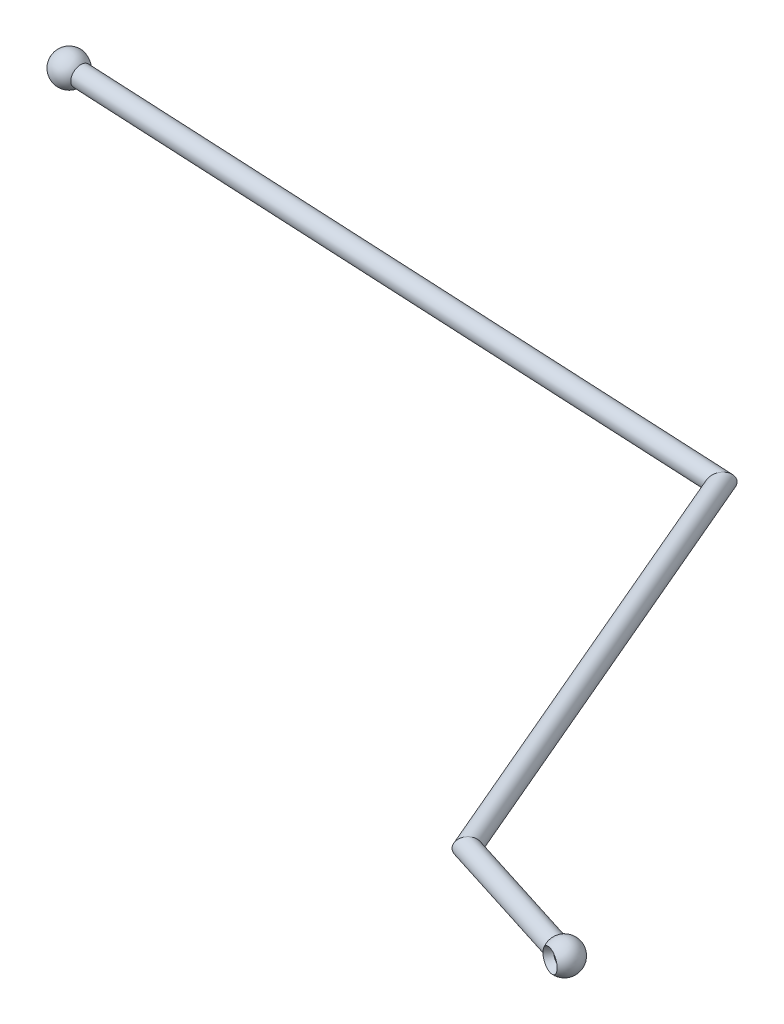
ISO-10303-21;
HEADER;
FILE_DESCRIPTION(('STEP AP214'),'2;1');
FILE_NAME('part.step','',(''),(''),'','','');
FILE_SCHEMA(('AUTOMOTIVE_DESIGN { 1 0 10303 214 1 1 1 1 }'));
ENDSEC;
DATA;
#1=APPLICATION_CONTEXT('core data for automotive mechanical design processes');
#2=APPLICATION_PROTOCOL_DEFINITION('international standard','automotive_design',2000,#1);
#3=PRODUCT_CONTEXT('',#1,'mechanical');
#4=PRODUCT('Part','Part','',(#3));
#5=PRODUCT_RELATED_PRODUCT_CATEGORY('part','',(#4));
#6=PRODUCT_DEFINITION_FORMATION('','',#4);
#7=PRODUCT_DEFINITION_CONTEXT('part definition',#1,'design');
#8=PRODUCT_DEFINITION('design','',#6,#7);
#9=PRODUCT_DEFINITION_SHAPE('','',#8);
#10=(LENGTH_UNIT() NAMED_UNIT(*) SI_UNIT(.MILLI.,.METRE.));
#11=(NAMED_UNIT(*) PLANE_ANGLE_UNIT() SI_UNIT($,.RADIAN.));
#12=(NAMED_UNIT(*) SI_UNIT($,.STERADIAN.) SOLID_ANGLE_UNIT());
#13=UNCERTAINTY_MEASURE_WITH_UNIT(LENGTH_MEASURE(1.E-05),#10,'distance_accuracy_value','');
#14=(GEOMETRIC_REPRESENTATION_CONTEXT(3) GLOBAL_UNCERTAINTY_ASSIGNED_CONTEXT((#13)) GLOBAL_UNIT_ASSIGNED_CONTEXT((#10,
#11,#12)) REPRESENTATION_CONTEXT('',''));
#15=CARTESIAN_POINT('',(0.,0.,0.));
#16=DIRECTION('',(0.,0.,1.));
#17=DIRECTION('',(1.,0.,0.));
#18=AXIS2_PLACEMENT_3D('',#15,#16,#17);
#19=CARTESIAN_POINT('',(655.634947961877,-118.40952516202,315.398460494731));
#20=DIRECTION('',(0.955972323576633,-0.0137295535950598,0.293135490709626));
#21=DIRECTION('',(0.293163122730262,0.,-0.95606243701499));
#22=AXIS2_PLACEMENT_3D('',#19,#20,#21);
#23=CYLINDRICAL_SURFACE('',#22,7.5);
#24=CARTESIAN_POINT('',(659.411977717178,-118.463770385628,316.556633637864));
#25=DIRECTION('',(0.742533523945312,-0.0106641725515588,0.669724003781519));
#26=DIRECTION('',(-0.669654944685931,0.00961749961428169,0.742610098745534));
#27=AXIS2_PLACEMENT_3D('',#24,#25,#26);
#28=ELLIPSE('',#27,8.27533439221869,7.5);
#29=CARTESIAN_POINT('',(653.8703591225,-118.384182360303,322.701980528022));
#30=VERTEX_POINT('',#29);
#31=EDGE_CURVE('E50',#30,#30,#28,.F.);
#32=ORIENTED_EDGE('',*,*,#31,.F.);
#33=EDGE_LOOP('',(#32));
#34=FACE_BOUND('',#33,.T.);
#35=CARTESIAN_POINT('',(757.422732428643,-119.871388447905,346.610255451595));
#36=DIRECTION('',(0.955972323576634,-0.0137295535950597,0.293135490709628));
#37=DIRECTION('',(0.293163122730264,0.,-0.956062437014989));
#38=AXIS2_PLACEMENT_3D('',#35,#36,#37);
#39=CIRCLE('',#38,7.5);
#40=CARTESIAN_POINT('',(759.62145584912,-119.871388447905,339.439787173983));
#41=VERTEX_POINT('',#40);
#42=EDGE_CURVE('E46',#41,#41,#39,.F.);
#43=ORIENTED_EDGE('',*,*,#42,.T.);
#44=EDGE_LOOP('',(#43));
#45=FACE_BOUND('',#44,.T.);
#46=ADVANCED_FACE('F43',(#34,#45),#23,.T.);
#47=CARTESIAN_POINT('',(0.461014548223054,-109.,-37.9972033916488));
#48=DIRECTION('',(0.9992595810573,-0.014351239711809,0.035697781218497));
#49=DIRECTION('',(0.0357014579097026,0.,-0.999362499748275));
#50=AXIS2_PLACEMENT_3D('',#47,#48,#49);
#51=CYLINDRICAL_SURFACE('',#50,7.5);
#52=CARTESIAN_POINT('',(517.078217954847,-116.419590931005,-19.5414505016858));
#53=DIRECTION('',(0.823588556744551,-0.0118282746803767,0.56706435359447));
#54=DIRECTION('',(0.567005880326111,-0.00814326673551168,-0.823673490457527));
#55=AXIS2_PLACEMENT_3D('',#52,#53,#54);
#56=ELLIPSE('',#55,8.89266785575622,7.5);
#57=CARTESIAN_POINT('',(522.120412920848,-116.492006297345,-26.866105273916));
#58=VERTEX_POINT('',#57);
#59=EDGE_CURVE('E10',#58,#58,#56,.F.);
#60=ORIENTED_EDGE('',*,*,#59,.T.);
#61=EDGE_LOOP('',(#60));
#62=FACE_BOUND('',#61,.T.);
#63=CARTESIAN_POINT('',(9.82157567359768,-109.134435194912,-37.6628045332637));
#64=DIRECTION('',(-0.9992595810573,0.0143512397118092,-0.0356977812184967));
#65=DIRECTION('',(-0.0357014579097022,0.,0.999362499748275));
#66=AXIS2_PLACEMENT_3D('',#63,#64,#65);
#67=CIRCLE('',#66,7.5);
#68=CARTESIAN_POINT('',(9.55381473927491,-109.134435194912,-30.1675857851516));
#69=VERTEX_POINT('',#68);
#70=EDGE_CURVE('E55',#69,#69,#67,.F.);
#71=ORIENTED_EDGE('',*,*,#70,.T.);
#72=EDGE_LOOP('',(#71));
#73=FACE_BOUND('',#72,.T.);
#74=ADVANCED_FACE('F91',(#62,#73),#51,.T.);
#75=CARTESIAN_POINT('',(514.987581416748,-116.389565473479,-24.478149541047));
#76=DIRECTION('',(0.389955506198168,-0.00560049165650065,0.92081666887548));
#77=DIRECTION('',(0.920831110155942,0.,-0.389961621918075));
#78=AXIS2_PLACEMENT_3D('',#75,#76,#77);
#79=CYLINDRICAL_SURFACE('',#78,7.5);
#80=ORIENTED_EDGE('',*,*,#59,.F.);
#81=EDGE_LOOP('',(#80));
#82=FACE_BOUND('',#81,.T.);
#83=ORIENTED_EDGE('',*,*,#31,.T.);
#84=EDGE_LOOP('',(#83));
#85=FACE_BOUND('',#84,.T.);
#86=ADVANCED_FACE('F98',(#82,#85),#79,.T.);
#87=CARTESIAN_POINT('',(0.461014548223053,-109.,-37.9972033916488));
#88=DIRECTION('',(-0.0357014579097026,0.,0.999362499748275));
#89=DIRECTION('',(-0.999362499748275,0.,-0.0357014579097026));
#90=AXIS2_PLACEMENT_3D('',#87,#88,#89);
#91=SPHERICAL_SURFACE('',#90,11.9999999999998);
#92=CARTESIAN_POINT('',(0.774003402446909,-109.,-46.7584513087961));
#93=DIRECTION('',(-0.0357014579097026,0.,0.999362499748275));
#94=DIRECTION('',(0.999362499748275,0.,0.0357014579097026));
#95=AXIS2_PLACEMENT_3D('',#92,#93,#94);
#96=CIRCLE('',#95,8.19405717037711);
#97=CARTESIAN_POINT('',(8.96283685931526,-109.,-46.4659115216182));
#98=VERTEX_POINT('',#97);
#99=EDGE_CURVE('E58',#98,#98,#96,.T.);
#100=ORIENTED_EDGE('',*,*,#99,.T.);
#101=EDGE_LOOP('',(#100));
#102=FACE_BOUND('',#101,.T.);
#103=ORIENTED_EDGE('',*,*,#70,.F.);
#104=EDGE_LOOP('',(#103));
#105=FACE_BOUND('',#104,.T.);
#106=ADVANCED_FACE('F115',(#102,#105),#91,.T.);
#107=CARTESIAN_POINT('',(0.577594216608513,-109.,-41.2605252736904));
#108=DIRECTION('',(0.0357014579097026,0.,-0.999362499748275));
#109=DIRECTION('',(-0.999362499748275,0.,-0.0357014579097026));
#110=AXIS2_PLACEMENT_3D('',#107,#108,#109);
#111=CONICAL_SURFACE('',#110,6.19169923971662,0.349065850398863);
#112=ORIENTED_EDGE('',*,*,#99,.F.);
#113=EDGE_LOOP('',(#112));
#114=FACE_BOUND('',#113,.T.);
#115=CARTESIAN_POINT('',(0.577594216608513,-109.,-41.2605252736904));
#116=DIRECTION('',(-0.0357014579097026,0.,0.999362499748275));
#117=DIRECTION('',(0.999362499748275,0.,0.0357014579097026));
#118=AXIS2_PLACEMENT_3D('',#115,#116,#117);
#119=CIRCLE('',#118,6.19169923971662);
#120=CARTESIAN_POINT('',(6.76534624650121,-109.,-41.0394725838941));
#121=VERTEX_POINT('',#120);
#122=EDGE_CURVE('E64',#121,#121,#119,.T.);
#123=ORIENTED_EDGE('',*,*,#122,.T.);
#124=EDGE_LOOP('',(#123));
#125=FACE_BOUND('',#124,.T.);
#126=ADVANCED_FACE('F109',(#114,#125),#111,.F.);
#127=CARTESIAN_POINT('',(0.461014548223053,-109.,-37.9972033916488));
#128=DIRECTION('',(-0.0357014579097026,0.,0.999362499748275));
#129=DIRECTION('',(-0.999362499748275,0.,-0.0357014579097026));
#130=AXIS2_PLACEMENT_3D('',#127,#128,#129);
#131=SPHERICAL_SURFACE('',#130,7.);
#132=ORIENTED_EDGE('',*,*,#122,.F.);
#133=EDGE_LOOP('',(#132));
#134=FACE_BOUND('',#133,.T.);
#135=ADVANCED_FACE('F104',(#134),#131,.F.);
#136=CARTESIAN_POINT('',(766.37780029952,-119.999999999985,349.356201280703));
#137=DIRECTION('',(0.293163122730262,0.,-0.95606243701499));
#138=DIRECTION('',(-0.95606243701499,0.,-0.293163122730262));
#139=AXIS2_PLACEMENT_3D('',#136,#137,#138);
#140=SPHERICAL_SURFACE('',#139,11.9999999999889);
#141=CARTESIAN_POINT('',(763.807035067561,-119.999999999985,357.739970868673));
#142=DIRECTION('',(0.293163122730262,0.,-0.95606243701499));
#143=DIRECTION('',(-0.95606243701499,0.,-0.293163122730262));
#144=AXIS2_PLACEMENT_3D('',#141,#142,#143);
#145=CIRCLE('',#144,8.1916770943268);
#146=CARTESIAN_POINT('',(755.975280301519,-119.999999999985,355.338473231302));
#147=VERTEX_POINT('',#146);
#148=EDGE_CURVE('E71',#147,#147,#145,.T.);
#149=ORIENTED_EDGE('',*,*,#148,.T.);
#150=EDGE_LOOP('',(#149));
#151=FACE_BOUND('',#150,.T.);
#152=ORIENTED_EDGE('',*,*,#42,.F.);
#153=EDGE_LOOP('',(#152));
#154=FACE_BOUND('',#153,.T.);
#155=ADVANCED_FACE('F87',(#151,#154),#140,.T.);
#156=CARTESIAN_POINT('',(765.419455798074,-119.999999999985,352.481550645998));
#157=DIRECTION('',(-0.293163122730262,0.,0.95606243701499));
#158=DIRECTION('',(0.95606243701499,0.,0.293163122730262));
#159=AXIS2_PLACEMENT_3D('',#156,#157,#158);
#160=CONICAL_SURFACE('',#159,6.18981156105394,0.349065850398864);
#161=ORIENTED_EDGE('',*,*,#148,.F.);
#162=EDGE_LOOP('',(#161));
#163=FACE_BOUND('',#162,.T.);
#164=CARTESIAN_POINT('',(765.419455798074,-119.999999999985,352.481550645998));
#165=DIRECTION('',(0.293163122730262,0.,-0.95606243701499));
#166=DIRECTION('',(-0.95606243701499,0.,-0.293163122730262));
#167=AXIS2_PLACEMENT_3D('',#164,#165,#166);
#168=CIRCLE('',#167,6.18981156105397);
#169=CARTESIAN_POINT('',(759.501609472349,-119.999999999985,350.666926159647));
#170=VERTEX_POINT('',#169);
#171=EDGE_CURVE('E75',#170,#170,#168,.T.);
#172=ORIENTED_EDGE('',*,*,#171,.T.);
#173=EDGE_LOOP('',(#172));
#174=FACE_BOUND('',#173,.T.);
#175=ADVANCED_FACE('F79',(#163,#174),#160,.F.);
#176=CARTESIAN_POINT('',(766.37780029952,-119.999999999985,349.356201280703));
#177=DIRECTION('',(0.293163122730262,0.,-0.95606243701499));
#178=DIRECTION('',(0.95606243701499,0.,0.293163122730262));
#179=AXIS2_PLACEMENT_3D('',#176,#177,#178);
#180=SPHERICAL_SURFACE('',#179,6.99999999999702);
#181=ORIENTED_EDGE('',*,*,#171,.F.);
#182=EDGE_LOOP('',(#181));
#183=FACE_BOUND('',#182,.T.);
#184=ADVANCED_FACE('F81',(#183),#180,.F.);
#185=CLOSED_SHELL('',(#46,#74,#86,#106,#126,#135,#155,#175,#184));
#186=MANIFOLD_SOLID_BREP('B2',#185);
#187=ADVANCED_BREP_SHAPE_REPRESENTATION('',(#18,#186),#14);
#188=SHAPE_DEFINITION_REPRESENTATION(#9,#187);
ENDSEC;
END-ISO-10303-21;
